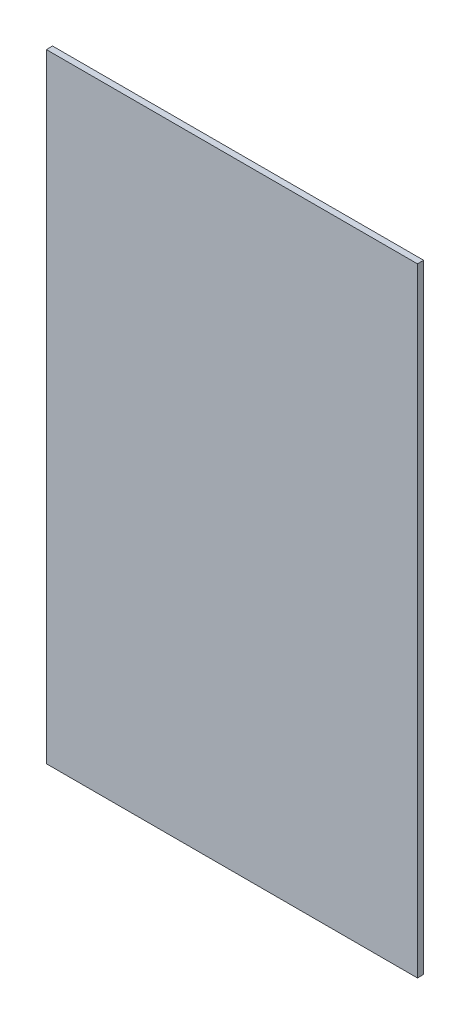
ISO-10303-21;
HEADER;
FILE_DESCRIPTION(('STEP AP214'),'2;1');
FILE_NAME('part.step','',(''),(''),'','','');
FILE_SCHEMA(('AUTOMOTIVE_DESIGN { 1 0 10303 214 1 1 1 1 }'));
ENDSEC;
DATA;
#1=APPLICATION_CONTEXT('core data for automotive mechanical design processes');
#2=APPLICATION_PROTOCOL_DEFINITION('international standard','automotive_design',2000,#1);
#3=PRODUCT_CONTEXT('',#1,'mechanical');
#4=PRODUCT('Part','Part','',(#3));
#5=PRODUCT_RELATED_PRODUCT_CATEGORY('part','',(#4));
#6=PRODUCT_DEFINITION_FORMATION('','',#4);
#7=PRODUCT_DEFINITION_CONTEXT('part definition',#1,'design');
#8=PRODUCT_DEFINITION('design','',#6,#7);
#9=PRODUCT_DEFINITION_SHAPE('','',#8);
#10=(LENGTH_UNIT() NAMED_UNIT(*) SI_UNIT(.MILLI.,.METRE.));
#11=(NAMED_UNIT(*) PLANE_ANGLE_UNIT() SI_UNIT($,.RADIAN.));
#12=(NAMED_UNIT(*) SI_UNIT($,.STERADIAN.) SOLID_ANGLE_UNIT());
#13=UNCERTAINTY_MEASURE_WITH_UNIT(LENGTH_MEASURE(1.E-05),#10,'distance_accuracy_value','');
#14=(GEOMETRIC_REPRESENTATION_CONTEXT(3) GLOBAL_UNCERTAINTY_ASSIGNED_CONTEXT((#13)) GLOBAL_UNIT_ASSIGNED_CONTEXT((#10,
#11,#12)) REPRESENTATION_CONTEXT('',''));
#15=CARTESIAN_POINT('',(0.,0.,0.));
#16=DIRECTION('',(0.,0.,1.));
#17=DIRECTION('',(1.,0.,0.));
#18=AXIS2_PLACEMENT_3D('',#15,#16,#17);
#19=CARTESIAN_POINT('',(0.,0.,2.54));
#20=DIRECTION('',(1.,0.,0.));
#21=DIRECTION('',(0.,1.,0.));
#22=AXIS2_PLACEMENT_3D('',#19,#20,#21);
#23=PLANE('',#22);
#24=DIRECTION('',(0.,-1.,0.));
#25=VECTOR('',#24,1.);
#26=CARTESIAN_POINT('',(0.,0.,0.));
#27=LINE('',#26,#25);
#28=CARTESIAN_POINT('',(0.,0.,0.));
#29=VERTEX_POINT('',#28);
#30=CARTESIAN_POINT('',(0.,-254.,0.));
#31=VERTEX_POINT('',#30);
#32=EDGE_CURVE('E113',#29,#31,#27,.T.);
#33=ORIENTED_EDGE('',*,*,#32,.T.);
#34=DIRECTION('',(0.,0.,-1.));
#35=VECTOR('',#34,1.);
#36=CARTESIAN_POINT('',(0.,-254.,2.54));
#37=LINE('',#36,#35);
#38=CARTESIAN_POINT('',(0.,-254.,2.54));
#39=VERTEX_POINT('',#38);
#40=EDGE_CURVE('E11',#39,#31,#37,.T.);
#41=ORIENTED_EDGE('',*,*,#40,.F.);
#42=DIRECTION('',(0.,-1.,0.));
#43=VECTOR('',#42,1.);
#44=CARTESIAN_POINT('',(0.,0.,2.54));
#45=LINE('',#44,#43);
#46=CARTESIAN_POINT('',(0.,0.,2.54));
#47=VERTEX_POINT('',#46);
#48=EDGE_CURVE('E97',#47,#39,#45,.T.);
#49=ORIENTED_EDGE('',*,*,#48,.F.);
#50=DIRECTION('',(0.,0.,-1.));
#51=VECTOR('',#50,1.);
#52=CARTESIAN_POINT('',(0.,0.,2.54));
#53=LINE('',#52,#51);
#54=EDGE_CURVE('E109',#47,#29,#53,.T.);
#55=ORIENTED_EDGE('',*,*,#54,.T.);
#56=EDGE_LOOP('',(#33,#41,#49,#55));
#57=FACE_BOUND('',#56,.T.);
#58=ADVANCED_FACE('F45',(#57),#23,.F.);
#59=CARTESIAN_POINT('',(0.,-254.,2.54));
#60=DIRECTION('',(0.,1.,0.));
#61=DIRECTION('',(0.,0.,1.));
#62=AXIS2_PLACEMENT_3D('',#59,#60,#61);
#63=PLANE('',#62);
#64=DIRECTION('',(1.,0.,0.));
#65=VECTOR('',#64,1.);
#66=CARTESIAN_POINT('',(0.,-254.,0.));
#67=LINE('',#66,#65);
#68=CARTESIAN_POINT('',(152.4,-254.,0.));
#69=VERTEX_POINT('',#68);
#70=EDGE_CURVE('E102',#31,#69,#67,.T.);
#71=ORIENTED_EDGE('',*,*,#70,.T.);
#72=DIRECTION('',(0.,0.,-1.));
#73=VECTOR('',#72,1.);
#74=CARTESIAN_POINT('',(152.4,-254.,2.54));
#75=LINE('',#74,#73);
#76=CARTESIAN_POINT('',(152.4,-254.,2.54));
#77=VERTEX_POINT('',#76);
#78=EDGE_CURVE('E54',#77,#69,#75,.T.);
#79=ORIENTED_EDGE('',*,*,#78,.F.);
#80=DIRECTION('',(1.,0.,0.));
#81=VECTOR('',#80,1.);
#82=CARTESIAN_POINT('',(0.,-254.,2.54));
#83=LINE('',#82,#81);
#84=EDGE_CURVE('E92',#39,#77,#83,.T.);
#85=ORIENTED_EDGE('',*,*,#84,.F.);
#86=ORIENTED_EDGE('',*,*,#40,.T.);
#87=EDGE_LOOP('',(#71,#79,#85,#86));
#88=FACE_BOUND('',#87,.T.);
#89=ADVANCED_FACE('F101',(#88),#63,.F.);
#90=CARTESIAN_POINT('',(152.4,0.,2.54));
#91=DIRECTION('',(-1.,0.,0.));
#92=DIRECTION('',(0.,-1.,0.));
#93=AXIS2_PLACEMENT_3D('',#90,#91,#92);
#94=PLANE('',#93);
#95=DIRECTION('',(0.,1.,0.));
#96=VECTOR('',#95,1.);
#97=CARTESIAN_POINT('',(152.4,0.,0.));
#98=LINE('',#97,#96);
#99=CARTESIAN_POINT('',(152.4,0.,0.));
#100=VERTEX_POINT('',#99);
#101=EDGE_CURVE('E79',#69,#100,#98,.T.);
#102=ORIENTED_EDGE('',*,*,#101,.T.);
#103=DIRECTION('',(0.,0.,-1.));
#104=VECTOR('',#103,1.);
#105=CARTESIAN_POINT('',(152.4,0.,2.54));
#106=LINE('',#105,#104);
#107=CARTESIAN_POINT('',(152.4,0.,2.54));
#108=VERTEX_POINT('',#107);
#109=EDGE_CURVE('E104',#108,#100,#106,.T.);
#110=ORIENTED_EDGE('',*,*,#109,.F.);
#111=DIRECTION('',(0.,1.,0.));
#112=VECTOR('',#111,1.);
#113=CARTESIAN_POINT('',(152.4,0.,2.54));
#114=LINE('',#113,#112);
#115=EDGE_CURVE('E95',#77,#108,#114,.T.);
#116=ORIENTED_EDGE('',*,*,#115,.F.);
#117=ORIENTED_EDGE('',*,*,#78,.T.);
#118=EDGE_LOOP('',(#102,#110,#116,#117));
#119=FACE_BOUND('',#118,.T.);
#120=ADVANCED_FACE('F105',(#119),#94,.F.);
#121=CARTESIAN_POINT('',(0.,0.,2.54));
#122=DIRECTION('',(0.,-1.,0.));
#123=DIRECTION('',(0.,0.,-1.));
#124=AXIS2_PLACEMENT_3D('',#121,#122,#123);
#125=PLANE('',#124);
#126=DIRECTION('',(-1.,0.,0.));
#127=VECTOR('',#126,1.);
#128=CARTESIAN_POINT('',(0.,0.,0.));
#129=LINE('',#128,#127);
#130=EDGE_CURVE('E85',#100,#29,#129,.T.);
#131=ORIENTED_EDGE('',*,*,#130,.T.);
#132=ORIENTED_EDGE('',*,*,#54,.F.);
#133=DIRECTION('',(-1.,0.,0.));
#134=VECTOR('',#133,1.);
#135=CARTESIAN_POINT('',(0.,0.,2.54));
#136=LINE('',#135,#134);
#137=EDGE_CURVE('E62',#108,#47,#136,.T.);
#138=ORIENTED_EDGE('',*,*,#137,.F.);
#139=ORIENTED_EDGE('',*,*,#109,.T.);
#140=EDGE_LOOP('',(#131,#132,#138,#139));
#141=FACE_BOUND('',#140,.T.);
#142=ADVANCED_FACE('F126',(#141),#125,.F.);
#143=CARTESIAN_POINT('',(0.,0.,2.54));
#144=DIRECTION('',(0.,0.,1.));
#145=DIRECTION('',(1.,0.,0.));
#146=AXIS2_PLACEMENT_3D('',#143,#144,#145);
#147=PLANE('',#146);
#148=ORIENTED_EDGE('',*,*,#48,.T.);
#149=ORIENTED_EDGE('',*,*,#84,.T.);
#150=ORIENTED_EDGE('',*,*,#115,.T.);
#151=ORIENTED_EDGE('',*,*,#137,.T.);
#152=EDGE_LOOP('',(#148,#149,#150,#151));
#153=FACE_BOUND('',#152,.T.);
#154=ADVANCED_FACE('F93',(#153),#147,.T.);
#155=CARTESIAN_POINT('',(0.,0.,0.));
#156=DIRECTION('',(0.,0.,1.));
#157=DIRECTION('',(1.,0.,0.));
#158=AXIS2_PLACEMENT_3D('',#155,#156,#157);
#159=PLANE('',#158);
#160=ORIENTED_EDGE('',*,*,#32,.F.);
#161=ORIENTED_EDGE('',*,*,#130,.F.);
#162=ORIENTED_EDGE('',*,*,#101,.F.);
#163=ORIENTED_EDGE('',*,*,#70,.F.);
#164=EDGE_LOOP('',(#160,#161,#162,#163));
#165=FACE_BOUND('',#164,.T.);
#166=ADVANCED_FACE('F129',(#165),#159,.F.);
#167=CLOSED_SHELL('',(#58,#89,#120,#142,#154,#166));
#168=MANIFOLD_SOLID_BREP('B2',#167);
#169=ADVANCED_BREP_SHAPE_REPRESENTATION('',(#18,#168),#14);
#170=SHAPE_DEFINITION_REPRESENTATION(#9,#169);
ENDSEC;
END-ISO-10303-21;
